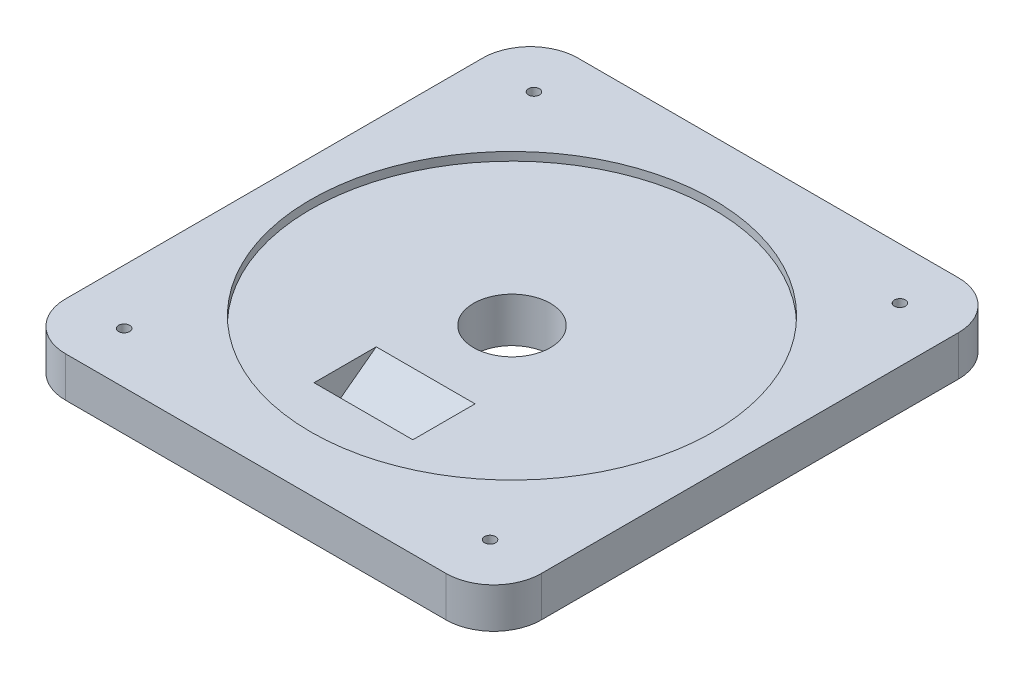
ISO-10303-21;
HEADER;
FILE_DESCRIPTION(('STEP AP214'),'2;1');
FILE_NAME('part.step','',(''),(''),'','','');
FILE_SCHEMA(('AUTOMOTIVE_DESIGN { 1 0 10303 214 1 1 1 1 }'));
ENDSEC;
DATA;
#1=APPLICATION_CONTEXT('core data for automotive mechanical design processes');
#2=APPLICATION_PROTOCOL_DEFINITION('international standard','automotive_design',2000,#1);
#3=PRODUCT_CONTEXT('',#1,'mechanical');
#4=PRODUCT('Part','Part','',(#3));
#5=PRODUCT_RELATED_PRODUCT_CATEGORY('part','',(#4));
#6=PRODUCT_DEFINITION_FORMATION('','',#4);
#7=PRODUCT_DEFINITION_CONTEXT('part definition',#1,'design');
#8=PRODUCT_DEFINITION('design','',#6,#7);
#9=PRODUCT_DEFINITION_SHAPE('','',#8);
#10=(LENGTH_UNIT() NAMED_UNIT(*) SI_UNIT(.MILLI.,.METRE.));
#11=(NAMED_UNIT(*) PLANE_ANGLE_UNIT() SI_UNIT($,.RADIAN.));
#12=(NAMED_UNIT(*) SI_UNIT($,.STERADIAN.) SOLID_ANGLE_UNIT());
#13=UNCERTAINTY_MEASURE_WITH_UNIT(LENGTH_MEASURE(1.E-05),#10,'distance_accuracy_value','');
#14=(GEOMETRIC_REPRESENTATION_CONTEXT(3) GLOBAL_UNCERTAINTY_ASSIGNED_CONTEXT((#13)) GLOBAL_UNIT_ASSIGNED_CONTEXT((#10,
#11,#12)) REPRESENTATION_CONTEXT('',''));
#15=CARTESIAN_POINT('',(0.,0.,0.));
#16=DIRECTION('',(0.,0.,1.));
#17=DIRECTION('',(1.,0.,0.));
#18=AXIS2_PLACEMENT_3D('',#15,#16,#17);
#19=CARTESIAN_POINT('',(0.,0.,0.));
#20=DIRECTION('',(0.,-1.,0.));
#21=DIRECTION('',(0.,0.,-1.));
#22=AXIS2_PLACEMENT_3D('',#19,#20,#21);
#23=PLANE('',#22);
#24=CARTESIAN_POINT('',(63.5,0.,71.12));
#25=DIRECTION('',(0.,-1.,0.));
#26=DIRECTION('',(0.,0.,-1.));
#27=AXIS2_PLACEMENT_3D('',#24,#25,#26);
#28=CIRCLE('',#27,1.90500000000001);
#29=CARTESIAN_POINT('',(63.5,0.,69.215));
#30=VERTEX_POINT('',#29);
#31=EDGE_CURVE('E257',#30,#30,#28,.T.);
#32=ORIENTED_EDGE('',*,*,#31,.F.);
#33=EDGE_LOOP('',(#32));
#34=FACE_BOUND('',#33,.T.);
#35=CARTESIAN_POINT('',(-63.5,0.,-71.12));
#36=DIRECTION('',(0.,-1.,0.));
#37=DIRECTION('',(0.,0.,-1.));
#38=AXIS2_PLACEMENT_3D('',#35,#36,#37);
#39=CIRCLE('',#38,1.905);
#40=CARTESIAN_POINT('',(-63.5,0.,-73.025));
#41=VERTEX_POINT('',#40);
#42=EDGE_CURVE('E266',#41,#41,#39,.T.);
#43=ORIENTED_EDGE('',*,*,#42,.F.);
#44=EDGE_LOOP('',(#43));
#45=FACE_BOUND('',#44,.T.);
#46=CARTESIAN_POINT('',(63.5,0.,-71.12));
#47=DIRECTION('',(0.,-1.,0.));
#48=DIRECTION('',(0.,0.,-1.));
#49=AXIS2_PLACEMENT_3D('',#46,#47,#48);
#50=CIRCLE('',#49,1.90500000000001);
#51=CARTESIAN_POINT('',(63.5,0.,-73.025));
#52=VERTEX_POINT('',#51);
#53=EDGE_CURVE('E249',#52,#52,#50,.T.);
#54=ORIENTED_EDGE('',*,*,#53,.F.);
#55=EDGE_LOOP('',(#54));
#56=FACE_BOUND('',#55,.T.);
#57=CARTESIAN_POINT('',(-63.5,0.,71.12));
#58=DIRECTION('',(0.,-1.,0.));
#59=DIRECTION('',(0.,0.,-1.));
#60=AXIS2_PLACEMENT_3D('',#57,#58,#59);
#61=CIRCLE('',#60,1.905);
#62=CARTESIAN_POINT('',(-63.5,0.,69.215));
#63=VERTEX_POINT('',#62);
#64=EDGE_CURVE('E261',#63,#63,#61,.T.);
#65=ORIENTED_EDGE('',*,*,#64,.F.);
#66=EDGE_LOOP('',(#65));
#67=FACE_BOUND('',#66,.T.);
#68=DIRECTION('',(-1.,0.,0.));
#69=VECTOR('',#68,1.);
#70=CARTESIAN_POINT('',(-82.55,0.,-88.9));
#71=LINE('',#70,#69);
#72=CARTESIAN_POINT('',(66.04,0.,-88.9));
#73=VERTEX_POINT('',#72);
#74=CARTESIAN_POINT('',(-66.04,0.,-88.9));
#75=VERTEX_POINT('',#74);
#76=EDGE_CURVE('E302',#73,#75,#71,.T.);
#77=ORIENTED_EDGE('',*,*,#76,.F.);
#78=CARTESIAN_POINT('',(66.04,0.,-72.39));
#79=DIRECTION('',(0.,-1.,0.));
#80=DIRECTION('',(0.,0.,-1.));
#81=AXIS2_PLACEMENT_3D('',#78,#79,#80);
#82=CIRCLE('',#81,16.51);
#83=CARTESIAN_POINT('',(82.55,0.,-72.39));
#84=VERTEX_POINT('',#83);
#85=EDGE_CURVE('E328',#73,#84,#82,.T.);
#86=ORIENTED_EDGE('',*,*,#85,.T.);
#87=DIRECTION('',(0.,0.,-1.));
#88=VECTOR('',#87,1.);
#89=CARTESIAN_POINT('',(82.55,0.,88.9));
#90=LINE('',#89,#88);
#91=CARTESIAN_POINT('',(82.55,0.,72.39));
#92=VERTEX_POINT('',#91);
#93=EDGE_CURVE('E277',#92,#84,#90,.T.);
#94=ORIENTED_EDGE('',*,*,#93,.F.);
#95=CARTESIAN_POINT('',(66.04,0.,72.39));
#96=DIRECTION('',(0.,-1.,0.));
#97=DIRECTION('',(0.,0.,-1.));
#98=AXIS2_PLACEMENT_3D('',#95,#96,#97);
#99=CIRCLE('',#98,16.51);
#100=CARTESIAN_POINT('',(66.04,0.,88.9));
#101=VERTEX_POINT('',#100);
#102=EDGE_CURVE('E319',#92,#101,#99,.T.);
#103=ORIENTED_EDGE('',*,*,#102,.T.);
#104=DIRECTION('',(1.,0.,0.));
#105=VECTOR('',#104,1.);
#106=CARTESIAN_POINT('',(-82.55,0.,88.9));
#107=LINE('',#106,#105);
#108=CARTESIAN_POINT('',(-66.04,0.,88.9));
#109=VERTEX_POINT('',#108);
#110=EDGE_CURVE('E286',#109,#101,#107,.T.);
#111=ORIENTED_EDGE('',*,*,#110,.F.);
#112=CARTESIAN_POINT('',(-66.04,0.,72.39));
#113=DIRECTION('',(0.,-1.,0.));
#114=DIRECTION('',(0.,0.,-1.));
#115=AXIS2_PLACEMENT_3D('',#112,#113,#114);
#116=CIRCLE('',#115,16.51);
#117=CARTESIAN_POINT('',(-82.55,0.,72.39));
#118=VERTEX_POINT('',#117);
#119=EDGE_CURVE('E322',#109,#118,#116,.T.);
#120=ORIENTED_EDGE('',*,*,#119,.T.);
#121=DIRECTION('',(0.,0.,1.));
#122=VECTOR('',#121,1.);
#123=CARTESIAN_POINT('',(-82.55,0.,88.9));
#124=LINE('',#123,#122);
#125=CARTESIAN_POINT('',(-82.55,0.,-72.39));
#126=VERTEX_POINT('',#125);
#127=EDGE_CURVE('E306',#126,#118,#124,.T.);
#128=ORIENTED_EDGE('',*,*,#127,.F.);
#129=CARTESIAN_POINT('',(-66.04,0.,-72.39));
#130=DIRECTION('',(0.,-1.,0.));
#131=DIRECTION('',(0.,0.,-1.));
#132=AXIS2_PLACEMENT_3D('',#129,#130,#131);
#133=CIRCLE('',#132,16.51);
#134=EDGE_CURVE('E325',#126,#75,#133,.T.);
#135=ORIENTED_EDGE('',*,*,#134,.T.);
#136=EDGE_LOOP('',(#77,#86,#94,#103,#111,#120,#128,#135));
#137=FACE_BOUND('',#136,.T.);
#138=DIRECTION('',(-1.,0.,0.));
#139=VECTOR('',#138,1.);
#140=CARTESIAN_POINT('',(-49.2524273513499,0.,49.53));
#141=LINE('',#140,#139);
#142=CARTESIAN_POINT('',(-17.145,0.,49.53));
#143=VERTEX_POINT('',#142);
#144=CARTESIAN_POINT('',(-49.2524273513499,0.,49.53));
#145=VERTEX_POINT('',#144);
#146=EDGE_CURVE('E237',#143,#145,#141,.T.);
#147=ORIENTED_EDGE('',*,*,#146,.F.);
#148=DIRECTION('',(0.,0.,1.));
#149=VECTOR('',#148,1.);
#150=CARTESIAN_POINT('',(-17.145,0.,0.));
#151=LINE('',#150,#149);
#152=CARTESIAN_POINT('',(-17.145,0.,51.562));
#153=VERTEX_POINT('',#152);
#154=EDGE_CURVE('E204',#143,#153,#151,.T.);
#155=ORIENTED_EDGE('',*,*,#154,.T.);
#156=DIRECTION('',(-1.,0.,0.));
#157=VECTOR('',#156,1.);
#158=CARTESIAN_POINT('',(0.,0.,51.562));
#159=LINE('',#158,#157);
#160=CARTESIAN_POINT('',(17.145,0.,51.562));
#161=VERTEX_POINT('',#160);
#162=EDGE_CURVE('E168',#161,#153,#159,.T.);
#163=ORIENTED_EDGE('',*,*,#162,.F.);
#164=DIRECTION('',(0.,0.,1.));
#165=VECTOR('',#164,1.);
#166=CARTESIAN_POINT('',(17.145,0.,0.));
#167=LINE('',#166,#165);
#168=CARTESIAN_POINT('',(17.145,0.,49.53));
#169=VERTEX_POINT('',#168);
#170=EDGE_CURVE('E198',#169,#161,#167,.T.);
#171=ORIENTED_EDGE('',*,*,#170,.F.);
#172=CARTESIAN_POINT('',(49.2524273513499,0.,49.53));
#173=VERTEX_POINT('',#172);
#174=EDGE_CURVE('E231',#173,#169,#141,.T.);
#175=ORIENTED_EDGE('',*,*,#174,.F.);
#176=CARTESIAN_POINT('',(0.,0.,0.));
#177=DIRECTION('',(0.,-1.,0.));
#178=DIRECTION('',(0.,0.,-1.));
#179=AXIS2_PLACEMENT_3D('',#176,#177,#178);
#180=CIRCLE('',#179,69.85);
#181=EDGE_CURVE('E225',#145,#173,#180,.T.);
#182=ORIENTED_EDGE('',*,*,#181,.F.);
#183=EDGE_LOOP('',(#147,#155,#163,#171,#175,#182));
#184=FACE_BOUND('',#183,.T.);
#185=ADVANCED_FACE('F54',(#34,#45,#56,#67,#137,#184),#23,.T.);
#186=CARTESIAN_POINT('',(-49.2524273513499,-4.445,49.53));
#187=DIRECTION('',(0.,0.,-1.));
#188=DIRECTION('',(-1.,0.,0.));
#189=AXIS2_PLACEMENT_3D('',#186,#187,#188);
#190=PLANE('',#189);
#191=DIRECTION('',(0.,-1.,0.));
#192=VECTOR('',#191,1.);
#193=CARTESIAN_POINT('',(-17.145,-4.445,49.53));
#194=LINE('',#193,#192);
#195=CARTESIAN_POINT('',(-17.145,-3.56197647058823,49.53));
#196=VERTEX_POINT('',#195);
#197=EDGE_CURVE('E201',#143,#196,#194,.T.);
#198=ORIENTED_EDGE('',*,*,#197,.F.);
#199=ORIENTED_EDGE('',*,*,#146,.T.);
#200=DIRECTION('',(0.,1.,0.));
#201=VECTOR('',#200,1.);
#202=CARTESIAN_POINT('',(-49.2524273513499,-4.445,49.53));
#203=LINE('',#202,#201);
#204=CARTESIAN_POINT('',(-49.2524273513499,-4.445,49.53));
#205=VERTEX_POINT('',#204);
#206=EDGE_CURVE('E234',#205,#145,#203,.T.);
#207=ORIENTED_EDGE('',*,*,#206,.F.);
#208=DIRECTION('',(-1.,0.,0.));
#209=VECTOR('',#208,1.);
#210=CARTESIAN_POINT('',(-49.2524273513499,-4.445,49.53));
#211=LINE('',#210,#209);
#212=CARTESIAN_POINT('',(49.2524273513499,-4.445,49.53));
#213=VERTEX_POINT('',#212);
#214=EDGE_CURVE('E230',#213,#205,#211,.T.);
#215=ORIENTED_EDGE('',*,*,#214,.F.);
#216=DIRECTION('',(0.,1.,0.));
#217=VECTOR('',#216,1.);
#218=CARTESIAN_POINT('',(49.2524273513499,-4.445,49.53));
#219=LINE('',#218,#217);
#220=EDGE_CURVE('E244',#213,#173,#219,.T.);
#221=ORIENTED_EDGE('',*,*,#220,.T.);
#222=ORIENTED_EDGE('',*,*,#174,.T.);
#223=DIRECTION('',(0.,-1.,0.));
#224=VECTOR('',#223,1.);
#225=CARTESIAN_POINT('',(17.145,-4.445,49.53));
#226=LINE('',#225,#224);
#227=CARTESIAN_POINT('',(17.145,-3.56197647058823,49.53));
#228=VERTEX_POINT('',#227);
#229=EDGE_CURVE('E190',#169,#228,#226,.T.);
#230=ORIENTED_EDGE('',*,*,#229,.T.);
#231=DIRECTION('',(-1.,0.,0.));
#232=VECTOR('',#231,1.);
#233=CARTESIAN_POINT('',(-49.2524273513499,-3.56197647058823,49.53));
#234=LINE('',#233,#232);
#235=EDGE_CURVE('E209',#228,#196,#234,.T.);
#236=ORIENTED_EDGE('',*,*,#235,.T.);
#237=EDGE_LOOP('',(#198,#199,#207,#215,#221,#222,#230,#236));
#238=FACE_BOUND('',#237,.T.);
#239=ADVANCED_FACE('F405',(#238),#190,.F.);
#240=CARTESIAN_POINT('',(0.,11.049,0.));
#241=DIRECTION('',(0.,1.,0.));
#242=DIRECTION('',(0.,0.,1.));
#243=AXIS2_PLACEMENT_3D('',#240,#241,#242);
#244=PLANE('',#243);
#245=CARTESIAN_POINT('',(0.,11.049,0.));
#246=DIRECTION('',(0.,1.,0.));
#247=DIRECTION('',(0.,0.,1.));
#248=AXIS2_PLACEMENT_3D('',#245,#246,#247);
#249=CIRCLE('',#248,69.85);
#250=CARTESIAN_POINT('',(0.,11.049,69.85));
#251=VERTEX_POINT('',#250);
#252=EDGE_CURVE('E214',#251,#251,#249,.T.);
#253=ORIENTED_EDGE('',*,*,#252,.T.);
#254=EDGE_LOOP('',(#253));
#255=FACE_BOUND('',#254,.T.);
#256=CARTESIAN_POINT('',(0.,11.049,0.));
#257=DIRECTION('',(0.,1.,0.));
#258=DIRECTION('',(0.,0.,1.));
#259=AXIS2_PLACEMENT_3D('',#256,#257,#258);
#260=CIRCLE('',#259,13.335);
#261=CARTESIAN_POINT('',(0.,11.049,13.335));
#262=VERTEX_POINT('',#261);
#263=EDGE_CURVE('E58',#262,#262,#260,.F.);
#264=ORIENTED_EDGE('',*,*,#263,.T.);
#265=EDGE_LOOP('',(#264));
#266=FACE_BOUND('',#265,.T.);
#267=DIRECTION('',(1.,0.,0.));
#268=VECTOR('',#267,1.);
#269=CARTESIAN_POINT('',(-17.145,11.049,51.562));
#270=LINE('',#269,#268);
#271=CARTESIAN_POINT('',(-17.145,11.049,51.562));
#272=VERTEX_POINT('',#271);
#273=CARTESIAN_POINT('',(17.145,11.049,51.562));
#274=VERTEX_POINT('',#273);
#275=EDGE_CURVE('E165',#272,#274,#270,.T.);
#276=ORIENTED_EDGE('',*,*,#275,.F.);
#277=DIRECTION('',(0.,0.,1.));
#278=VECTOR('',#277,1.);
#279=CARTESIAN_POINT('',(-17.145,11.049,29.972));
#280=LINE('',#279,#278);
#281=CARTESIAN_POINT('',(-17.145,11.049,29.972));
#282=VERTEX_POINT('',#281);
#283=EDGE_CURVE('E173',#282,#272,#280,.T.);
#284=ORIENTED_EDGE('',*,*,#283,.F.);
#285=DIRECTION('',(1.,0.,0.));
#286=VECTOR('',#285,1.);
#287=CARTESIAN_POINT('',(-17.145,11.049,29.972));
#288=LINE('',#287,#286);
#289=CARTESIAN_POINT('',(17.145,11.049,29.972));
#290=VERTEX_POINT('',#289);
#291=EDGE_CURVE('E186',#282,#290,#288,.T.);
#292=ORIENTED_EDGE('',*,*,#291,.T.);
#293=DIRECTION('',(0.,0.,1.));
#294=VECTOR('',#293,1.);
#295=CARTESIAN_POINT('',(17.145,11.049,29.972));
#296=LINE('',#295,#294);
#297=EDGE_CURVE('E184',#290,#274,#296,.T.);
#298=ORIENTED_EDGE('',*,*,#297,.T.);
#299=EDGE_LOOP('',(#276,#284,#292,#298));
#300=FACE_BOUND('',#299,.T.);
#301=ADVANCED_FACE('F183',(#255,#266,#300),#244,.T.);
#302=CARTESIAN_POINT('',(0.,13.97,0.));
#303=DIRECTION('',(0.,-1.,0.));
#304=DIRECTION('',(0.,0.,-1.));
#305=AXIS2_PLACEMENT_3D('',#302,#303,#304);
#306=CYLINDRICAL_SURFACE('',#305,13.335);
#307=CARTESIAN_POINT('',(0.,-4.445,0.));
#308=DIRECTION('',(0.,-1.,0.));
#309=DIRECTION('',(0.,0.,-1.));
#310=AXIS2_PLACEMENT_3D('',#307,#308,#309);
#311=CIRCLE('',#310,13.335);
#312=CARTESIAN_POINT('',(0.,-4.445,-13.335));
#313=VERTEX_POINT('',#312);
#314=EDGE_CURVE('E221',#313,#313,#311,.T.);
#315=ORIENTED_EDGE('',*,*,#314,.T.);
#316=EDGE_LOOP('',(#315));
#317=FACE_BOUND('',#316,.T.);
#318=ORIENTED_EDGE('',*,*,#263,.F.);
#319=EDGE_LOOP('',(#318));
#320=FACE_BOUND('',#319,.T.);
#321=ADVANCED_FACE('F426',(#317,#320),#306,.F.);
#322=CARTESIAN_POINT('',(82.55,13.97,88.9));
#323=DIRECTION('',(-1.,0.,0.));
#324=DIRECTION('',(0.,0.,1.));
#325=AXIS2_PLACEMENT_3D('',#322,#323,#324);
#326=PLANE('',#325);
#327=ORIENTED_EDGE('',*,*,#93,.T.);
#328=DIRECTION('',(0.,-1.,0.));
#329=VECTOR('',#328,1.);
#330=CARTESIAN_POINT('',(82.55,13.97,-72.39));
#331=LINE('',#330,#329);
#332=CARTESIAN_POINT('',(82.55,13.97,-72.39));
#333=VERTEX_POINT('',#332);
#334=EDGE_CURVE('E335',#84,#333,#331,.F.);
#335=ORIENTED_EDGE('',*,*,#334,.T.);
#336=DIRECTION('',(0.,0.,-1.));
#337=VECTOR('',#336,1.);
#338=CARTESIAN_POINT('',(82.55,13.97,88.9));
#339=LINE('',#338,#337);
#340=CARTESIAN_POINT('',(82.55,13.97,72.39));
#341=VERTEX_POINT('',#340);
#342=EDGE_CURVE('E281',#341,#333,#339,.T.);
#343=ORIENTED_EDGE('',*,*,#342,.F.);
#344=DIRECTION('',(0.,-1.,0.));
#345=VECTOR('',#344,1.);
#346=CARTESIAN_POINT('',(82.55,13.97,72.39));
#347=LINE('',#346,#345);
#348=EDGE_CURVE('E331',#341,#92,#347,.T.);
#349=ORIENTED_EDGE('',*,*,#348,.T.);
#350=EDGE_LOOP('',(#327,#335,#343,#349));
#351=FACE_BOUND('',#350,.T.);
#352=ADVANCED_FACE('F373',(#351),#326,.F.);
#353=CARTESIAN_POINT('',(-82.55,13.97,-88.9));
#354=DIRECTION('',(0.,0.,1.));
#355=DIRECTION('',(1.,0.,0.));
#356=AXIS2_PLACEMENT_3D('',#353,#354,#355);
#357=PLANE('',#356);
#358=DIRECTION('',(-1.,0.,0.));
#359=VECTOR('',#358,1.);
#360=CARTESIAN_POINT('',(-82.55,13.97,-88.9));
#361=LINE('',#360,#359);
#362=CARTESIAN_POINT('',(66.04,13.97,-88.9));
#363=VERTEX_POINT('',#362);
#364=CARTESIAN_POINT('',(-66.04,13.97,-88.9));
#365=VERTEX_POINT('',#364);
#366=EDGE_CURVE('E285',#363,#365,#361,.T.);
#367=ORIENTED_EDGE('',*,*,#366,.F.);
#368=DIRECTION('',(0.,-1.,0.));
#369=VECTOR('',#368,1.);
#370=CARTESIAN_POINT('',(66.04,13.97,-88.9));
#371=LINE('',#370,#369);
#372=EDGE_CURVE('E315',#363,#73,#371,.T.);
#373=ORIENTED_EDGE('',*,*,#372,.T.);
#374=ORIENTED_EDGE('',*,*,#76,.T.);
#375=DIRECTION('',(0.,-1.,0.));
#376=VECTOR('',#375,1.);
#377=CARTESIAN_POINT('',(-66.04,13.97,-88.9));
#378=LINE('',#377,#376);
#379=EDGE_CURVE('E298',#75,#365,#378,.F.);
#380=ORIENTED_EDGE('',*,*,#379,.T.);
#381=EDGE_LOOP('',(#367,#373,#374,#380));
#382=FACE_BOUND('',#381,.T.);
#383=ADVANCED_FACE('F384',(#382),#357,.F.);
#384=CARTESIAN_POINT('',(-82.55,13.97,88.9));
#385=DIRECTION('',(1.,0.,0.));
#386=DIRECTION('',(0.,0.,-1.));
#387=AXIS2_PLACEMENT_3D('',#384,#385,#386);
#388=PLANE('',#387);
#389=DIRECTION('',(0.,0.,1.));
#390=VECTOR('',#389,1.);
#391=CARTESIAN_POINT('',(-82.55,13.97,88.9));
#392=LINE('',#391,#390);
#393=CARTESIAN_POINT('',(-82.55,13.97,-72.39));
#394=VERTEX_POINT('',#393);
#395=CARTESIAN_POINT('',(-82.55,13.97,72.39));
#396=VERTEX_POINT('',#395);
#397=EDGE_CURVE('E290',#394,#396,#392,.T.);
#398=ORIENTED_EDGE('',*,*,#397,.F.);
#399=DIRECTION('',(0.,-1.,0.));
#400=VECTOR('',#399,1.);
#401=CARTESIAN_POINT('',(-82.55,13.97,-72.39));
#402=LINE('',#401,#400);
#403=EDGE_CURVE('E353',#394,#126,#402,.T.);
#404=ORIENTED_EDGE('',*,*,#403,.T.);
#405=ORIENTED_EDGE('',*,*,#127,.T.);
#406=DIRECTION('',(0.,-1.,0.));
#407=VECTOR('',#406,1.);
#408=CARTESIAN_POINT('',(-82.55,13.97,72.39));
#409=LINE('',#408,#407);
#410=EDGE_CURVE('E350',#118,#396,#409,.F.);
#411=ORIENTED_EDGE('',*,*,#410,.T.);
#412=EDGE_LOOP('',(#398,#404,#405,#411));
#413=FACE_BOUND('',#412,.T.);
#414=ADVANCED_FACE('F393',(#413),#388,.F.);
#415=CARTESIAN_POINT('',(-82.55,13.97,88.9));
#416=DIRECTION('',(0.,0.,-1.));
#417=DIRECTION('',(-1.,0.,0.));
#418=AXIS2_PLACEMENT_3D('',#415,#416,#417);
#419=PLANE('',#418);
#420=DIRECTION('',(1.,0.,0.));
#421=VECTOR('',#420,1.);
#422=CARTESIAN_POINT('',(-82.55,13.97,88.9));
#423=LINE('',#422,#421);
#424=CARTESIAN_POINT('',(-66.04,13.97,88.9));
#425=VERTEX_POINT('',#424);
#426=CARTESIAN_POINT('',(66.04,13.97,88.9));
#427=VERTEX_POINT('',#426);
#428=EDGE_CURVE('E294',#425,#427,#423,.T.);
#429=ORIENTED_EDGE('',*,*,#428,.F.);
#430=DIRECTION('',(0.,-1.,0.));
#431=VECTOR('',#430,1.);
#432=CARTESIAN_POINT('',(-66.04,13.97,88.9));
#433=LINE('',#432,#431);
#434=EDGE_CURVE('E13',#425,#109,#433,.T.);
#435=ORIENTED_EDGE('',*,*,#434,.T.);
#436=ORIENTED_EDGE('',*,*,#110,.T.);
#437=DIRECTION('',(0.,-1.,0.));
#438=VECTOR('',#437,1.);
#439=CARTESIAN_POINT('',(66.04,13.97,88.9));
#440=LINE('',#439,#438);
#441=EDGE_CURVE('E64',#101,#427,#440,.F.);
#442=ORIENTED_EDGE('',*,*,#441,.T.);
#443=EDGE_LOOP('',(#429,#435,#436,#442));
#444=FACE_BOUND('',#443,.T.);
#445=ADVANCED_FACE('F361',(#444),#419,.F.);
#446=CARTESIAN_POINT('',(0.,13.97,0.));
#447=DIRECTION('',(0.,-1.,0.));
#448=DIRECTION('',(0.,0.,-1.));
#449=AXIS2_PLACEMENT_3D('',#446,#447,#448);
#450=PLANE('',#449);
#451=CARTESIAN_POINT('',(0.,13.97,0.));
#452=DIRECTION('',(0.,1.,0.));
#453=DIRECTION('',(0.,0.,1.));
#454=AXIS2_PLACEMENT_3D('',#451,#452,#453);
#455=CIRCLE('',#454,69.85);
#456=CARTESIAN_POINT('',(0.,13.97,69.85));
#457=VERTEX_POINT('',#456);
#458=EDGE_CURVE('E213',#457,#457,#455,.T.);
#459=ORIENTED_EDGE('',*,*,#458,.F.);
#460=EDGE_LOOP('',(#459));
#461=FACE_BOUND('',#460,.T.);
#462=CARTESIAN_POINT('',(63.5,13.97,71.12));
#463=DIRECTION('',(0.,-1.,0.));
#464=DIRECTION('',(0.,0.,-1.));
#465=AXIS2_PLACEMENT_3D('',#462,#463,#464);
#466=CIRCLE('',#465,1.90500000000001);
#467=CARTESIAN_POINT('',(63.5,13.97,69.215));
#468=VERTEX_POINT('',#467);
#469=EDGE_CURVE('E262',#468,#468,#466,.T.);
#470=ORIENTED_EDGE('',*,*,#469,.T.);
#471=EDGE_LOOP('',(#470));
#472=FACE_BOUND('',#471,.T.);
#473=CARTESIAN_POINT('',(-63.5,13.97,-71.12));
#474=DIRECTION('',(0.,-1.,0.));
#475=DIRECTION('',(0.,0.,-1.));
#476=AXIS2_PLACEMENT_3D('',#473,#474,#475);
#477=CIRCLE('',#476,1.905);
#478=CARTESIAN_POINT('',(-63.5,13.97,-73.025));
#479=VERTEX_POINT('',#478);
#480=EDGE_CURVE('E253',#479,#479,#477,.T.);
#481=ORIENTED_EDGE('',*,*,#480,.T.);
#482=EDGE_LOOP('',(#481));
#483=FACE_BOUND('',#482,.T.);
#484=CARTESIAN_POINT('',(63.5,13.97,-71.12));
#485=DIRECTION('',(0.,-1.,0.));
#486=DIRECTION('',(0.,0.,-1.));
#487=AXIS2_PLACEMENT_3D('',#484,#485,#486);
#488=CIRCLE('',#487,1.90500000000001);
#489=CARTESIAN_POINT('',(63.5,13.97,-73.025));
#490=VERTEX_POINT('',#489);
#491=EDGE_CURVE('E248',#490,#490,#488,.T.);
#492=ORIENTED_EDGE('',*,*,#491,.T.);
#493=EDGE_LOOP('',(#492));
#494=FACE_BOUND('',#493,.T.);
#495=CARTESIAN_POINT('',(-63.5,13.97,71.12));
#496=DIRECTION('',(0.,-1.,0.));
#497=DIRECTION('',(0.,0.,-1.));
#498=AXIS2_PLACEMENT_3D('',#495,#496,#497);
#499=CIRCLE('',#498,1.905);
#500=CARTESIAN_POINT('',(-63.5,13.97,69.215));
#501=VERTEX_POINT('',#500);
#502=EDGE_CURVE('E273',#501,#501,#499,.T.);
#503=ORIENTED_EDGE('',*,*,#502,.T.);
#504=EDGE_LOOP('',(#503));
#505=FACE_BOUND('',#504,.T.);
#506=ORIENTED_EDGE('',*,*,#342,.T.);
#507=CARTESIAN_POINT('',(66.04,13.97,-72.39));
#508=DIRECTION('',(0.,-1.,0.));
#509=DIRECTION('',(0.,0.,-1.));
#510=AXIS2_PLACEMENT_3D('',#507,#508,#509);
#511=CIRCLE('',#510,16.51);
#512=EDGE_CURVE('E347',#333,#363,#511,.F.);
#513=ORIENTED_EDGE('',*,*,#512,.T.);
#514=ORIENTED_EDGE('',*,*,#366,.T.);
#515=CARTESIAN_POINT('',(-66.04,13.97,-72.39));
#516=DIRECTION('',(0.,-1.,0.));
#517=DIRECTION('',(0.,0.,-1.));
#518=AXIS2_PLACEMENT_3D('',#515,#516,#517);
#519=CIRCLE('',#518,16.51);
#520=EDGE_CURVE('E344',#365,#394,#519,.F.);
#521=ORIENTED_EDGE('',*,*,#520,.T.);
#522=ORIENTED_EDGE('',*,*,#397,.T.);
#523=CARTESIAN_POINT('',(-66.04,13.97,72.39));
#524=DIRECTION('',(0.,-1.,0.));
#525=DIRECTION('',(0.,0.,-1.));
#526=AXIS2_PLACEMENT_3D('',#523,#524,#525);
#527=CIRCLE('',#526,16.51);
#528=EDGE_CURVE('E341',#396,#425,#527,.F.);
#529=ORIENTED_EDGE('',*,*,#528,.T.);
#530=ORIENTED_EDGE('',*,*,#428,.T.);
#531=CARTESIAN_POINT('',(66.04,13.97,72.39));
#532=DIRECTION('',(0.,-1.,0.));
#533=DIRECTION('',(0.,0.,-1.));
#534=AXIS2_PLACEMENT_3D('',#531,#532,#533);
#535=CIRCLE('',#534,16.51);
#536=EDGE_CURVE('E338',#427,#341,#535,.F.);
#537=ORIENTED_EDGE('',*,*,#536,.T.);
#538=EDGE_LOOP('',(#506,#513,#514,#521,#522,#529,#530,#537));
#539=FACE_BOUND('',#538,.T.);
#540=ADVANCED_FACE('F367',(#461,#472,#483,#494,#505,#539),#450,.F.);
#541=CARTESIAN_POINT('',(66.04,13.97,-72.39));
#542=DIRECTION('',(0.,-1.,0.));
#543=DIRECTION('',(0.,0.,-1.));
#544=AXIS2_PLACEMENT_3D('',#541,#542,#543);
#545=CYLINDRICAL_SURFACE('',#544,16.51);
#546=ORIENTED_EDGE('',*,*,#512,.F.);
#547=ORIENTED_EDGE('',*,*,#334,.F.);
#548=ORIENTED_EDGE('',*,*,#85,.F.);
#549=ORIENTED_EDGE('',*,*,#372,.F.);
#550=EDGE_LOOP('',(#546,#547,#548,#549));
#551=FACE_BOUND('',#550,.T.);
#552=ADVANCED_FACE('F381',(#551),#545,.T.);
#553=CARTESIAN_POINT('',(-66.04,13.97,-72.39));
#554=DIRECTION('',(0.,-1.,0.));
#555=DIRECTION('',(0.,0.,-1.));
#556=AXIS2_PLACEMENT_3D('',#553,#554,#555);
#557=CYLINDRICAL_SURFACE('',#556,16.51);
#558=ORIENTED_EDGE('',*,*,#520,.F.);
#559=ORIENTED_EDGE('',*,*,#379,.F.);
#560=ORIENTED_EDGE('',*,*,#134,.F.);
#561=ORIENTED_EDGE('',*,*,#403,.F.);
#562=EDGE_LOOP('',(#558,#559,#560,#561));
#563=FACE_BOUND('',#562,.T.);
#564=ADVANCED_FACE('F390',(#563),#557,.T.);
#565=CARTESIAN_POINT('',(-66.04,13.97,72.39));
#566=DIRECTION('',(0.,-1.,0.));
#567=DIRECTION('',(0.,0.,-1.));
#568=AXIS2_PLACEMENT_3D('',#565,#566,#567);
#569=CYLINDRICAL_SURFACE('',#568,16.51);
#570=ORIENTED_EDGE('',*,*,#528,.F.);
#571=ORIENTED_EDGE('',*,*,#410,.F.);
#572=ORIENTED_EDGE('',*,*,#119,.F.);
#573=ORIENTED_EDGE('',*,*,#434,.F.);
#574=EDGE_LOOP('',(#570,#571,#572,#573));
#575=FACE_BOUND('',#574,.T.);
#576=ADVANCED_FACE('F396',(#575),#569,.T.);
#577=CARTESIAN_POINT('',(66.04,13.97,72.39));
#578=DIRECTION('',(0.,-1.,0.));
#579=DIRECTION('',(0.,0.,-1.));
#580=AXIS2_PLACEMENT_3D('',#577,#578,#579);
#581=CYLINDRICAL_SURFACE('',#580,16.51);
#582=ORIENTED_EDGE('',*,*,#536,.F.);
#583=ORIENTED_EDGE('',*,*,#441,.F.);
#584=ORIENTED_EDGE('',*,*,#102,.F.);
#585=ORIENTED_EDGE('',*,*,#348,.F.);
#586=EDGE_LOOP('',(#582,#583,#584,#585));
#587=FACE_BOUND('',#586,.T.);
#588=ADVANCED_FACE('F56',(#587),#581,.T.);
#589=CARTESIAN_POINT('',(-63.5,13.97,71.12));
#590=DIRECTION('',(0.,-1.,0.));
#591=DIRECTION('',(0.,0.,-1.));
#592=AXIS2_PLACEMENT_3D('',#589,#590,#591);
#593=CYLINDRICAL_SURFACE('',#592,1.905);
#594=ORIENTED_EDGE('',*,*,#502,.F.);
#595=EDGE_LOOP('',(#594));
#596=FACE_BOUND('',#595,.T.);
#597=ORIENTED_EDGE('',*,*,#64,.T.);
#598=EDGE_LOOP('',(#597));
#599=FACE_BOUND('',#598,.T.);
#600=ADVANCED_FACE('F402',(#596,#599),#593,.F.);
#601=CARTESIAN_POINT('',(63.5,13.97,-71.12));
#602=DIRECTION('',(0.,-1.,0.));
#603=DIRECTION('',(0.,0.,-1.));
#604=AXIS2_PLACEMENT_3D('',#601,#602,#603);
#605=CYLINDRICAL_SURFACE('',#604,1.90500000000001);
#606=ORIENTED_EDGE('',*,*,#491,.F.);
#607=EDGE_LOOP('',(#606));
#608=FACE_BOUND('',#607,.T.);
#609=ORIENTED_EDGE('',*,*,#53,.T.);
#610=EDGE_LOOP('',(#609));
#611=FACE_BOUND('',#610,.T.);
#612=ADVANCED_FACE('F446',(#608,#611),#605,.F.);
#613=CARTESIAN_POINT('',(-63.5,13.97,-71.12));
#614=DIRECTION('',(0.,-1.,0.));
#615=DIRECTION('',(0.,0.,-1.));
#616=AXIS2_PLACEMENT_3D('',#613,#614,#615);
#617=CYLINDRICAL_SURFACE('',#616,1.905);
#618=ORIENTED_EDGE('',*,*,#480,.F.);
#619=EDGE_LOOP('',(#618));
#620=FACE_BOUND('',#619,.T.);
#621=ORIENTED_EDGE('',*,*,#42,.T.);
#622=EDGE_LOOP('',(#621));
#623=FACE_BOUND('',#622,.T.);
#624=ADVANCED_FACE('F452',(#620,#623),#617,.F.);
#625=CARTESIAN_POINT('',(63.5,13.97,71.12));
#626=DIRECTION('',(0.,-1.,0.));
#627=DIRECTION('',(0.,0.,-1.));
#628=AXIS2_PLACEMENT_3D('',#625,#626,#627);
#629=CYLINDRICAL_SURFACE('',#628,1.90500000000001);
#630=ORIENTED_EDGE('',*,*,#469,.F.);
#631=EDGE_LOOP('',(#630));
#632=FACE_BOUND('',#631,.T.);
#633=ORIENTED_EDGE('',*,*,#31,.T.);
#634=EDGE_LOOP('',(#633));
#635=FACE_BOUND('',#634,.T.);
#636=ADVANCED_FACE('F458',(#632,#635),#629,.F.);
#637=CARTESIAN_POINT('',(0.,-4.445,0.));
#638=DIRECTION('',(0.,1.,0.));
#639=DIRECTION('',(0.,0.,1.));
#640=AXIS2_PLACEMENT_3D('',#637,#638,#639);
#641=CYLINDRICAL_SURFACE('',#640,69.85);
#642=ORIENTED_EDGE('',*,*,#181,.T.);
#643=ORIENTED_EDGE('',*,*,#220,.F.);
#644=CARTESIAN_POINT('',(0.,-4.445,0.));
#645=DIRECTION('',(0.,-1.,0.));
#646=DIRECTION('',(0.,0.,-1.));
#647=AXIS2_PLACEMENT_3D('',#644,#645,#646);
#648=CIRCLE('',#647,69.85);
#649=EDGE_CURVE('E226',#205,#213,#648,.T.);
#650=ORIENTED_EDGE('',*,*,#649,.F.);
#651=ORIENTED_EDGE('',*,*,#206,.T.);
#652=EDGE_LOOP('',(#642,#643,#650,#651));
#653=FACE_BOUND('',#652,.T.);
#654=ADVANCED_FACE('F461',(#653),#641,.T.);
#655=CARTESIAN_POINT('',(0.,-4.445,0.));
#656=DIRECTION('',(0.,-1.,0.));
#657=DIRECTION('',(0.,0.,-1.));
#658=AXIS2_PLACEMENT_3D('',#655,#656,#657);
#659=PLANE('',#658);
#660=ORIENTED_EDGE('',*,*,#314,.F.);
#661=EDGE_LOOP('',(#660));
#662=FACE_BOUND('',#661,.T.);
#663=ORIENTED_EDGE('',*,*,#649,.T.);
#664=ORIENTED_EDGE('',*,*,#214,.T.);
#665=EDGE_LOOP('',(#663,#664));
#666=FACE_BOUND('',#665,.T.);
#667=ADVANCED_FACE('F465',(#662,#666),#659,.T.);
#668=CARTESIAN_POINT('',(0.,11.049,0.));
#669=DIRECTION('',(0.,1.,0.));
#670=DIRECTION('',(0.,0.,1.));
#671=AXIS2_PLACEMENT_3D('',#668,#669,#670);
#672=CYLINDRICAL_SURFACE('',#671,69.85);
#673=ORIENTED_EDGE('',*,*,#252,.F.);
#674=EDGE_LOOP('',(#673));
#675=FACE_BOUND('',#674,.T.);
#676=ORIENTED_EDGE('',*,*,#458,.T.);
#677=EDGE_LOOP('',(#676));
#678=FACE_BOUND('',#677,.T.);
#679=ADVANCED_FACE('F470',(#675,#678),#672,.F.);
#680=CARTESIAN_POINT('',(-17.145,-5.08,51.562));
#681=DIRECTION('',(0.,-0.801129585165643,-0.598490925388451));
#682=DIRECTION('',(0.,0.598490925388451,-0.801129585165643));
#683=AXIS2_PLACEMENT_3D('',#680,#681,#682);
#684=PLANE('',#683);
#685=DIRECTION('',(0.,0.598490925388451,-0.801129585165643));
#686=VECTOR('',#685,1.);
#687=CARTESIAN_POINT('',(17.145,-5.08,51.562));
#688=LINE('',#687,#686);
#689=EDGE_CURVE('E71',#228,#290,#688,.T.);
#690=ORIENTED_EDGE('',*,*,#689,.T.);
#691=ORIENTED_EDGE('',*,*,#291,.F.);
#692=DIRECTION('',(0.,0.598490925388451,-0.801129585165643));
#693=VECTOR('',#692,1.);
#694=CARTESIAN_POINT('',(-17.145,-5.08,51.562));
#695=LINE('',#694,#693);
#696=EDGE_CURVE('E172',#196,#282,#695,.T.);
#697=ORIENTED_EDGE('',*,*,#696,.F.);
#698=ORIENTED_EDGE('',*,*,#235,.F.);
#699=EDGE_LOOP('',(#690,#691,#697,#698));
#700=FACE_BOUND('',#699,.T.);
#701=ADVANCED_FACE('F477',(#700),#684,.F.);
#702=CARTESIAN_POINT('',(-17.145,11.049,51.562));
#703=DIRECTION('',(0.,0.,1.));
#704=DIRECTION('',(1.,0.,0.));
#705=AXIS2_PLACEMENT_3D('',#702,#703,#704);
#706=PLANE('',#705);
#707=ORIENTED_EDGE('',*,*,#162,.T.);
#708=DIRECTION('',(0.,-1.,0.));
#709=VECTOR('',#708,1.);
#710=CARTESIAN_POINT('',(-17.145,11.049,51.562));
#711=LINE('',#710,#709);
#712=EDGE_CURVE('E161',#272,#153,#711,.T.);
#713=ORIENTED_EDGE('',*,*,#712,.F.);
#714=ORIENTED_EDGE('',*,*,#275,.T.);
#715=DIRECTION('',(0.,-1.,0.));
#716=VECTOR('',#715,1.);
#717=CARTESIAN_POINT('',(17.145,11.049,51.562));
#718=LINE('',#717,#716);
#719=EDGE_CURVE('E77',#274,#161,#718,.T.);
#720=ORIENTED_EDGE('',*,*,#719,.T.);
#721=EDGE_LOOP('',(#707,#713,#714,#720));
#722=FACE_BOUND('',#721,.T.);
#723=ADVANCED_FACE('F163',(#722),#706,.F.);
#724=CARTESIAN_POINT('',(-17.145,0.,0.));
#725=DIRECTION('',(1.,0.,0.));
#726=DIRECTION('',(0.,0.,-1.));
#727=AXIS2_PLACEMENT_3D('',#724,#725,#726);
#728=PLANE('',#727);
#729=ORIENTED_EDGE('',*,*,#197,.T.);
#730=ORIENTED_EDGE('',*,*,#696,.T.);
#731=ORIENTED_EDGE('',*,*,#283,.T.);
#732=ORIENTED_EDGE('',*,*,#712,.T.);
#733=ORIENTED_EDGE('',*,*,#154,.F.);
#734=EDGE_LOOP('',(#729,#730,#731,#732,#733));
#735=FACE_BOUND('',#734,.T.);
#736=ADVANCED_FACE('F176',(#735),#728,.T.);
#737=CARTESIAN_POINT('',(17.145,0.,0.));
#738=DIRECTION('',(1.,0.,0.));
#739=DIRECTION('',(0.,0.,-1.));
#740=AXIS2_PLACEMENT_3D('',#737,#738,#739);
#741=PLANE('',#740);
#742=ORIENTED_EDGE('',*,*,#170,.T.);
#743=ORIENTED_EDGE('',*,*,#719,.F.);
#744=ORIENTED_EDGE('',*,*,#297,.F.);
#745=ORIENTED_EDGE('',*,*,#689,.F.);
#746=ORIENTED_EDGE('',*,*,#229,.F.);
#747=EDGE_LOOP('',(#742,#743,#744,#745,#746));
#748=FACE_BOUND('',#747,.T.);
#749=ADVANCED_FACE('F487',(#748),#741,.F.);
#750=CLOSED_SHELL('',(#185,#239,#301,#321,#352,#383,#414,#445,#540,#552,#564,#576,#588,#600,
#612,#624,#636,#654,#667,#679,#701,#723,#736,#749));
#751=MANIFOLD_SOLID_BREP('B2',#750);
#752=ADVANCED_BREP_SHAPE_REPRESENTATION('',(#18,#751),#14);
#753=SHAPE_DEFINITION_REPRESENTATION(#9,#752);
ENDSEC;
END-ISO-10303-21;
